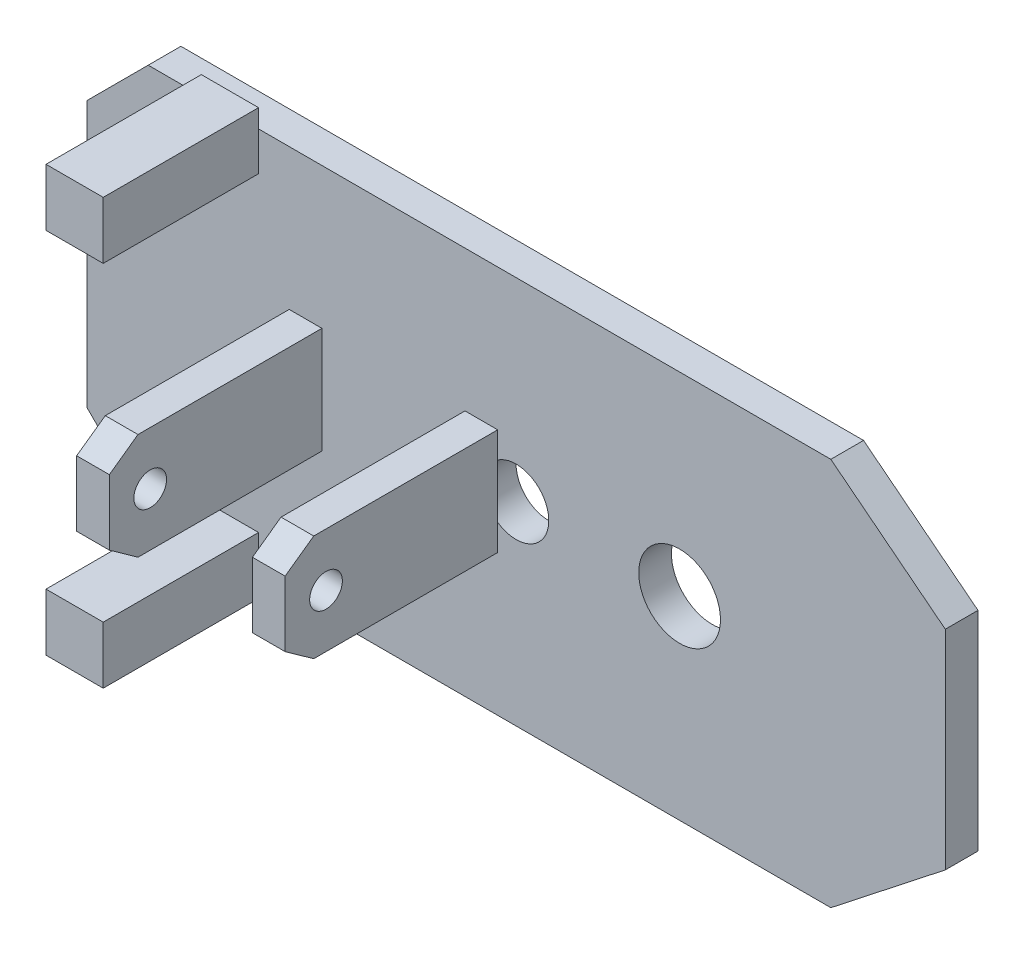
ISO-10303-21;
HEADER;
FILE_DESCRIPTION(('STEP AP214'),'2;1');
FILE_NAME('part.step','',(''),(''),'','','');
FILE_SCHEMA(('AUTOMOTIVE_DESIGN { 1 0 10303 214 1 1 1 1 }'));
ENDSEC;
DATA;
#1=APPLICATION_CONTEXT('core data for automotive mechanical design processes');
#2=APPLICATION_PROTOCOL_DEFINITION('international standard','automotive_design',2000,#1);
#3=PRODUCT_CONTEXT('',#1,'mechanical');
#4=PRODUCT('Part','Part','',(#3));
#5=PRODUCT_RELATED_PRODUCT_CATEGORY('part','',(#4));
#6=PRODUCT_DEFINITION_FORMATION('','',#4);
#7=PRODUCT_DEFINITION_CONTEXT('part definition',#1,'design');
#8=PRODUCT_DEFINITION('design','',#6,#7);
#9=PRODUCT_DEFINITION_SHAPE('','',#8);
#10=(LENGTH_UNIT() NAMED_UNIT(*) SI_UNIT(.MILLI.,.METRE.));
#11=(NAMED_UNIT(*) PLANE_ANGLE_UNIT() SI_UNIT($,.RADIAN.));
#12=(NAMED_UNIT(*) SI_UNIT($,.STERADIAN.) SOLID_ANGLE_UNIT());
#13=UNCERTAINTY_MEASURE_WITH_UNIT(LENGTH_MEASURE(1.E-05),#10,'distance_accuracy_value','');
#14=(GEOMETRIC_REPRESENTATION_CONTEXT(3) GLOBAL_UNCERTAINTY_ASSIGNED_CONTEXT((#13)) GLOBAL_UNIT_ASSIGNED_CONTEXT((#10,
#11,#12)) REPRESENTATION_CONTEXT('',''));
#15=CARTESIAN_POINT('',(0.,0.,0.));
#16=DIRECTION('',(0.,0.,1.));
#17=DIRECTION('',(1.,0.,0.));
#18=AXIS2_PLACEMENT_3D('',#15,#16,#17);
#19=CARTESIAN_POINT('',(0.,0.,-42.));
#20=DIRECTION('',(0.,0.,1.));
#21=DIRECTION('',(1.,0.,0.));
#22=AXIS2_PLACEMENT_3D('',#19,#20,#21);
#23=PLANE('',#22);
#24=DIRECTION('',(0.,-1.,0.));
#25=VECTOR('',#24,1.);
#26=CARTESIAN_POINT('',(-47.,38.,-42.));
#27=LINE('',#26,#25);
#28=CARTESIAN_POINT('',(-47.,47.5,-42.));
#29=VERTEX_POINT('',#28);
#30=CARTESIAN_POINT('',(-47.,38.,-42.));
#31=VERTEX_POINT('',#30);
#32=EDGE_CURVE('E11',#29,#31,#27,.T.);
#33=ORIENTED_EDGE('',*,*,#32,.F.);
#34=DIRECTION('',(-1.,0.,0.));
#35=VECTOR('',#34,1.);
#36=CARTESIAN_POINT('',(-60.,47.5,-42.));
#37=LINE('',#36,#35);
#38=CARTESIAN_POINT('',(-60.,47.5,-42.));
#39=VERTEX_POINT('',#38);
#40=EDGE_CURVE('E438',#29,#39,#37,.T.);
#41=ORIENTED_EDGE('',*,*,#40,.T.);
#42=DIRECTION('',(-0.707106781186547,-0.707106781186547,0.));
#43=VECTOR('',#42,1.);
#44=CARTESIAN_POINT('',(-75.,32.5,-42.));
#45=LINE('',#44,#43);
#46=CARTESIAN_POINT('',(-75.,32.5,-42.));
#47=VERTEX_POINT('',#46);
#48=EDGE_CURVE('E419',#39,#47,#45,.T.);
#49=ORIENTED_EDGE('',*,*,#48,.T.);
#50=DIRECTION('',(0.,-1.,0.));
#51=VECTOR('',#50,1.);
#52=CARTESIAN_POINT('',(-75.,-32.5,-42.));
#53=LINE('',#52,#51);
#54=CARTESIAN_POINT('',(-75.,-32.5,-42.));
#55=VERTEX_POINT('',#54);
#56=EDGE_CURVE('E421',#47,#55,#53,.T.);
#57=ORIENTED_EDGE('',*,*,#56,.T.);
#58=DIRECTION('',(0.707106781186547,-0.707106781186547,0.));
#59=VECTOR('',#58,1.);
#60=CARTESIAN_POINT('',(-60.,-47.5,-42.));
#61=LINE('',#60,#59);
#62=CARTESIAN_POINT('',(-60.,-47.5,-42.));
#63=VERTEX_POINT('',#62);
#64=EDGE_CURVE('E426',#55,#63,#61,.T.);
#65=ORIENTED_EDGE('',*,*,#64,.T.);
#66=DIRECTION('',(1.,0.,0.));
#67=VECTOR('',#66,1.);
#68=CARTESIAN_POINT('',(107.,-47.5,-42.));
#69=LINE('',#68,#67);
#70=CARTESIAN_POINT('',(-47.,-47.5,-42.));
#71=VERTEX_POINT('',#70);
#72=EDGE_CURVE('E427',#63,#71,#69,.T.);
#73=ORIENTED_EDGE('',*,*,#72,.T.);
#74=DIRECTION('',(0.,-1.,0.));
#75=VECTOR('',#74,1.);
#76=CARTESIAN_POINT('',(-47.,-52.,-42.));
#77=LINE('',#76,#75);
#78=CARTESIAN_POINT('',(-47.,-38.,-42.));
#79=VERTEX_POINT('',#78);
#80=EDGE_CURVE('E268',#79,#71,#77,.T.);
#81=ORIENTED_EDGE('',*,*,#80,.F.);
#82=DIRECTION('',(-1.,0.,0.));
#83=VECTOR('',#82,1.);
#84=CARTESIAN_POINT('',(-47.,-38.,-42.));
#85=LINE('',#84,#83);
#86=CARTESIAN_POINT('',(-33.,-38.,-42.));
#87=VERTEX_POINT('',#86);
#88=EDGE_CURVE('E279',#87,#79,#85,.T.);
#89=ORIENTED_EDGE('',*,*,#88,.F.);
#90=DIRECTION('',(0.,1.,0.));
#91=VECTOR('',#90,1.);
#92=CARTESIAN_POINT('',(-33.,-38.,-42.));
#93=LINE('',#92,#91);
#94=CARTESIAN_POINT('',(-33.,-47.5,-42.));
#95=VERTEX_POINT('',#94);
#96=EDGE_CURVE('E48',#95,#87,#93,.T.);
#97=ORIENTED_EDGE('',*,*,#96,.F.);
#98=CARTESIAN_POINT('',(107.,-47.5,-42.));
#99=VERTEX_POINT('',#98);
#100=EDGE_CURVE('E428',#95,#99,#69,.T.);
#101=ORIENTED_EDGE('',*,*,#100,.T.);
#102=DIRECTION('',(0.786318338822423,0.617821551931904,0.));
#103=VECTOR('',#102,1.);
#104=CARTESIAN_POINT('',(135.,-25.5,-42.));
#105=LINE('',#104,#103);
#106=CARTESIAN_POINT('',(135.,-25.5,-42.));
#107=VERTEX_POINT('',#106);
#108=EDGE_CURVE('E435',#99,#107,#105,.T.);
#109=ORIENTED_EDGE('',*,*,#108,.T.);
#110=DIRECTION('',(0.,1.,0.));
#111=VECTOR('',#110,1.);
#112=CARTESIAN_POINT('',(135.,25.5,-42.));
#113=LINE('',#112,#111);
#114=CARTESIAN_POINT('',(135.,25.5,-42.));
#115=VERTEX_POINT('',#114);
#116=EDGE_CURVE('E434',#107,#115,#113,.T.);
#117=ORIENTED_EDGE('',*,*,#116,.T.);
#118=DIRECTION('',(-0.786318338822423,0.617821551931904,0.));
#119=VECTOR('',#118,1.);
#120=CARTESIAN_POINT('',(107.,47.5,-42.));
#121=LINE('',#120,#119);
#122=CARTESIAN_POINT('',(107.,47.5,-42.));
#123=VERTEX_POINT('',#122);
#124=EDGE_CURVE('E440',#115,#123,#121,.T.);
#125=ORIENTED_EDGE('',*,*,#124,.T.);
#126=CARTESIAN_POINT('',(-33.,47.5,-42.));
#127=VERTEX_POINT('',#126);
#128=EDGE_CURVE('E439',#123,#127,#37,.T.);
#129=ORIENTED_EDGE('',*,*,#128,.T.);
#130=DIRECTION('',(0.,1.,0.));
#131=VECTOR('',#130,1.);
#132=CARTESIAN_POINT('',(-33.,52.,-42.));
#133=LINE('',#132,#131);
#134=CARTESIAN_POINT('',(-33.,38.,-42.));
#135=VERTEX_POINT('',#134);
#136=EDGE_CURVE('E832',#135,#127,#133,.T.);
#137=ORIENTED_EDGE('',*,*,#136,.F.);
#138=DIRECTION('',(1.,0.,0.));
#139=VECTOR('',#138,1.);
#140=CARTESIAN_POINT('',(-33.,38.,-42.));
#141=LINE('',#140,#139);
#142=EDGE_CURVE('E833',#31,#135,#141,.T.);
#143=ORIENTED_EDGE('',*,*,#142,.F.);
#144=EDGE_LOOP('',(#33,#41,#49,#57,#65,#73,#81,#89,#97,#101,#109,#117,#125,#129,#137,#143));
#145=FACE_BOUND('',#144,.T.);
#146=DIRECTION('',(-1.,0.,0.));
#147=VECTOR('',#146,1.);
#148=CARTESIAN_POINT('',(-17.5,13.,-42.));
#149=LINE('',#148,#147);
#150=CARTESIAN_POINT('',(-17.5,13.,-42.));
#151=VERTEX_POINT('',#150);
#152=CARTESIAN_POINT('',(-25.5,13.,-42.));
#153=VERTEX_POINT('',#152);
#154=EDGE_CURVE('E325',#151,#153,#149,.T.);
#155=ORIENTED_EDGE('',*,*,#154,.F.);
#156=DIRECTION('',(0.,1.,0.));
#157=VECTOR('',#156,1.);
#158=CARTESIAN_POINT('',(-17.5,13.,-42.));
#159=LINE('',#158,#157);
#160=CARTESIAN_POINT('',(-17.5,-13.,-42.));
#161=VERTEX_POINT('',#160);
#162=EDGE_CURVE('E319',#161,#151,#159,.T.);
#163=ORIENTED_EDGE('',*,*,#162,.F.);
#164=DIRECTION('',(-1.,0.,0.));
#165=VECTOR('',#164,1.);
#166=CARTESIAN_POINT('',(-17.5,-13.,-42.));
#167=LINE('',#166,#165);
#168=CARTESIAN_POINT('',(-25.5,-13.,-42.));
#169=VERTEX_POINT('',#168);
#170=EDGE_CURVE('E340',#161,#169,#167,.T.);
#171=ORIENTED_EDGE('',*,*,#170,.T.);
#172=DIRECTION('',(0.,1.,0.));
#173=VECTOR('',#172,1.);
#174=CARTESIAN_POINT('',(-25.5,13.,-42.));
#175=LINE('',#174,#173);
#176=EDGE_CURVE('E315',#169,#153,#175,.T.);
#177=ORIENTED_EDGE('',*,*,#176,.T.);
#178=EDGE_LOOP('',(#155,#163,#171,#177));
#179=FACE_BOUND('',#178,.T.);
#180=DIRECTION('',(0.,1.,0.));
#181=VECTOR('',#180,1.);
#182=CARTESIAN_POINT('',(25.5,13.,-42.));
#183=LINE('',#182,#181);
#184=CARTESIAN_POINT('',(25.5,6.61437827766148,-42.));
#185=VERTEX_POINT('',#184);
#186=CARTESIAN_POINT('',(25.5,13.,-42.));
#187=VERTEX_POINT('',#186);
#188=EDGE_CURVE('E376',#185,#187,#183,.T.);
#189=ORIENTED_EDGE('',*,*,#188,.F.);
#190=CARTESIAN_POINT('',(30.,0.,-42.));
#191=DIRECTION('',(0.,0.,1.));
#192=DIRECTION('',(1.,0.,0.));
#193=AXIS2_PLACEMENT_3D('',#190,#191,#192);
#194=CIRCLE('',#193,8.);
#195=CARTESIAN_POINT('',(25.5,-6.61437827766147,-42.));
#196=VERTEX_POINT('',#195);
#197=EDGE_CURVE('E412',#196,#185,#194,.T.);
#198=ORIENTED_EDGE('',*,*,#197,.F.);
#199=CARTESIAN_POINT('',(25.5,-13.,-42.));
#200=VERTEX_POINT('',#199);
#201=EDGE_CURVE('E375',#200,#196,#183,.T.);
#202=ORIENTED_EDGE('',*,*,#201,.F.);
#203=DIRECTION('',(-1.,0.,0.));
#204=VECTOR('',#203,1.);
#205=CARTESIAN_POINT('',(25.5,-13.,-42.));
#206=LINE('',#205,#204);
#207=CARTESIAN_POINT('',(17.5,-13.,-42.));
#208=VERTEX_POINT('',#207);
#209=EDGE_CURVE('E391',#200,#208,#206,.T.);
#210=ORIENTED_EDGE('',*,*,#209,.T.);
#211=DIRECTION('',(0.,1.,0.));
#212=VECTOR('',#211,1.);
#213=CARTESIAN_POINT('',(17.5,13.,-42.));
#214=LINE('',#213,#212);
#215=CARTESIAN_POINT('',(17.5,13.,-42.));
#216=VERTEX_POINT('',#215);
#217=EDGE_CURVE('E361',#208,#216,#214,.T.);
#218=ORIENTED_EDGE('',*,*,#217,.T.);
#219=DIRECTION('',(-1.,0.,0.));
#220=VECTOR('',#219,1.);
#221=CARTESIAN_POINT('',(25.5,13.,-42.));
#222=LINE('',#221,#220);
#223=EDGE_CURVE('E374',#187,#216,#222,.T.);
#224=ORIENTED_EDGE('',*,*,#223,.F.);
#225=EDGE_LOOP('',(#189,#198,#202,#210,#218,#224));
#226=FACE_BOUND('',#225,.T.);
#227=CARTESIAN_POINT('',(70.,0.,-42.));
#228=DIRECTION('',(0.,0.,1.));
#229=DIRECTION('',(1.,0.,0.));
#230=AXIS2_PLACEMENT_3D('',#227,#228,#229);
#231=CIRCLE('',#230,9.99999999999999);
#232=CARTESIAN_POINT('',(80.,0.,-42.));
#233=VERTEX_POINT('',#232);
#234=EDGE_CURVE('E411',#233,#233,#231,.T.);
#235=ORIENTED_EDGE('',*,*,#234,.F.);
#236=EDGE_LOOP('',(#235));
#237=FACE_BOUND('',#236,.T.);
#238=ADVANCED_FACE('F39',(#145,#179,#226,#237),#23,.T.);
#239=CARTESIAN_POINT('',(0.,0.,-50.));
#240=DIRECTION('',(0.,0.,1.));
#241=DIRECTION('',(1.,0.,0.));
#242=AXIS2_PLACEMENT_3D('',#239,#240,#241);
#243=PLANE('',#242);
#244=DIRECTION('',(-0.707106781186547,-0.707106781186547,0.));
#245=VECTOR('',#244,1.);
#246=CARTESIAN_POINT('',(-75.,32.5,-50.));
#247=LINE('',#246,#245);
#248=CARTESIAN_POINT('',(-60.,47.5,-50.));
#249=VERTEX_POINT('',#248);
#250=CARTESIAN_POINT('',(-75.,32.5,-50.));
#251=VERTEX_POINT('',#250);
#252=EDGE_CURVE('E417',#249,#251,#247,.T.);
#253=ORIENTED_EDGE('',*,*,#252,.F.);
#254=DIRECTION('',(-1.,0.,0.));
#255=VECTOR('',#254,1.);
#256=CARTESIAN_POINT('',(-60.,47.5,-50.));
#257=LINE('',#256,#255);
#258=CARTESIAN_POINT('',(107.,47.5,-50.));
#259=VERTEX_POINT('',#258);
#260=EDGE_CURVE('E424',#259,#249,#257,.T.);
#261=ORIENTED_EDGE('',*,*,#260,.F.);
#262=DIRECTION('',(-0.786318338822423,0.617821551931904,0.));
#263=VECTOR('',#262,1.);
#264=CARTESIAN_POINT('',(107.,47.5,-50.));
#265=LINE('',#264,#263);
#266=CARTESIAN_POINT('',(135.,25.5,-50.));
#267=VERTEX_POINT('',#266);
#268=EDGE_CURVE('E460',#267,#259,#265,.T.);
#269=ORIENTED_EDGE('',*,*,#268,.F.);
#270=DIRECTION('',(0.,1.,0.));
#271=VECTOR('',#270,1.);
#272=CARTESIAN_POINT('',(135.,25.5,-50.));
#273=LINE('',#272,#271);
#274=CARTESIAN_POINT('',(135.,-25.5,-50.));
#275=VERTEX_POINT('',#274);
#276=EDGE_CURVE('E453',#275,#267,#273,.T.);
#277=ORIENTED_EDGE('',*,*,#276,.F.);
#278=DIRECTION('',(0.786318338822423,0.617821551931904,0.));
#279=VECTOR('',#278,1.);
#280=CARTESIAN_POINT('',(135.,-25.5,-50.));
#281=LINE('',#280,#279);
#282=CARTESIAN_POINT('',(107.,-47.5,-50.));
#283=VERTEX_POINT('',#282);
#284=EDGE_CURVE('E454',#283,#275,#281,.T.);
#285=ORIENTED_EDGE('',*,*,#284,.F.);
#286=DIRECTION('',(1.,0.,0.));
#287=VECTOR('',#286,1.);
#288=CARTESIAN_POINT('',(107.,-47.5,-50.));
#289=LINE('',#288,#287);
#290=CARTESIAN_POINT('',(-60.,-47.5,-50.));
#291=VERTEX_POINT('',#290);
#292=EDGE_CURVE('E452',#291,#283,#289,.T.);
#293=ORIENTED_EDGE('',*,*,#292,.F.);
#294=DIRECTION('',(0.707106781186547,-0.707106781186547,0.));
#295=VECTOR('',#294,1.);
#296=CARTESIAN_POINT('',(-60.,-47.5,-50.));
#297=LINE('',#296,#295);
#298=CARTESIAN_POINT('',(-75.,-32.5,-50.));
#299=VERTEX_POINT('',#298);
#300=EDGE_CURVE('E448',#299,#291,#297,.T.);
#301=ORIENTED_EDGE('',*,*,#300,.F.);
#302=DIRECTION('',(0.,-1.,0.));
#303=VECTOR('',#302,1.);
#304=CARTESIAN_POINT('',(-75.,-32.5,-50.));
#305=LINE('',#304,#303);
#306=EDGE_CURVE('E450',#251,#299,#305,.T.);
#307=ORIENTED_EDGE('',*,*,#306,.F.);
#308=EDGE_LOOP('',(#253,#261,#269,#277,#285,#293,#301,#307));
#309=FACE_BOUND('',#308,.T.);
#310=CARTESIAN_POINT('',(70.,0.,-50.));
#311=DIRECTION('',(0.,0.,1.));
#312=DIRECTION('',(1.,0.,0.));
#313=AXIS2_PLACEMENT_3D('',#310,#311,#312);
#314=CIRCLE('',#313,9.99999999999999);
#315=CARTESIAN_POINT('',(80.,0.,-50.));
#316=VERTEX_POINT('',#315);
#317=EDGE_CURVE('E409',#316,#316,#314,.T.);
#318=ORIENTED_EDGE('',*,*,#317,.T.);
#319=EDGE_LOOP('',(#318));
#320=FACE_BOUND('',#319,.T.);
#321=CARTESIAN_POINT('',(30.,0.,-50.));
#322=DIRECTION('',(0.,0.,1.));
#323=DIRECTION('',(1.,0.,0.));
#324=AXIS2_PLACEMENT_3D('',#321,#322,#323);
#325=CIRCLE('',#324,8.);
#326=CARTESIAN_POINT('',(38.,0.,-50.));
#327=VERTEX_POINT('',#326);
#328=EDGE_CURVE('E406',#327,#327,#325,.T.);
#329=ORIENTED_EDGE('',*,*,#328,.T.);
#330=EDGE_LOOP('',(#329));
#331=FACE_BOUND('',#330,.T.);
#332=ADVANCED_FACE('F517',(#309,#320,#331),#243,.F.);
#333=CARTESIAN_POINT('',(-75.,32.5,-42.));
#334=DIRECTION('',(0.707106781186547,-0.707106781186547,0.));
#335=DIRECTION('',(0.707106781186548,0.707106781186548,0.));
#336=AXIS2_PLACEMENT_3D('',#333,#334,#335);
#337=PLANE('',#336);
#338=ORIENTED_EDGE('',*,*,#252,.T.);
#339=DIRECTION('',(0.,0.,-1.));
#340=VECTOR('',#339,1.);
#341=CARTESIAN_POINT('',(-75.,32.5,-42.));
#342=LINE('',#341,#340);
#343=EDGE_CURVE('E43',#47,#251,#342,.T.);
#344=ORIENTED_EDGE('',*,*,#343,.F.);
#345=ORIENTED_EDGE('',*,*,#48,.F.);
#346=DIRECTION('',(0.,0.,-1.));
#347=VECTOR('',#346,1.);
#348=CARTESIAN_POINT('',(-60.,47.5,-42.));
#349=LINE('',#348,#347);
#350=EDGE_CURVE('E444',#39,#249,#349,.T.);
#351=ORIENTED_EDGE('',*,*,#350,.T.);
#352=EDGE_LOOP('',(#338,#344,#345,#351));
#353=FACE_BOUND('',#352,.T.);
#354=ADVANCED_FACE('F41',(#353),#337,.F.);
#355=CARTESIAN_POINT('',(-75.,-32.5,-42.));
#356=DIRECTION('',(1.,0.,0.));
#357=DIRECTION('',(0.,0.,-1.));
#358=AXIS2_PLACEMENT_3D('',#355,#356,#357);
#359=PLANE('',#358);
#360=ORIENTED_EDGE('',*,*,#306,.T.);
#361=DIRECTION('',(0.,0.,-1.));
#362=VECTOR('',#361,1.);
#363=CARTESIAN_POINT('',(-75.,-32.5,-42.));
#364=LINE('',#363,#362);
#365=EDGE_CURVE('E478',#55,#299,#364,.T.);
#366=ORIENTED_EDGE('',*,*,#365,.F.);
#367=ORIENTED_EDGE('',*,*,#56,.F.);
#368=ORIENTED_EDGE('',*,*,#343,.T.);
#369=EDGE_LOOP('',(#360,#366,#367,#368));
#370=FACE_BOUND('',#369,.T.);
#371=ADVANCED_FACE('F551',(#370),#359,.F.);
#372=CARTESIAN_POINT('',(-60.,-47.5,-42.));
#373=DIRECTION('',(0.707106781186547,0.707106781186547,0.));
#374=DIRECTION('',(-0.707106781186548,0.707106781186548,0.));
#375=AXIS2_PLACEMENT_3D('',#372,#373,#374);
#376=PLANE('',#375);
#377=ORIENTED_EDGE('',*,*,#300,.T.);
#378=DIRECTION('',(0.,0.,-1.));
#379=VECTOR('',#378,1.);
#380=CARTESIAN_POINT('',(-60.,-47.5,-42.));
#381=LINE('',#380,#379);
#382=EDGE_CURVE('E475',#63,#291,#381,.T.);
#383=ORIENTED_EDGE('',*,*,#382,.F.);
#384=ORIENTED_EDGE('',*,*,#64,.F.);
#385=ORIENTED_EDGE('',*,*,#365,.T.);
#386=EDGE_LOOP('',(#377,#383,#384,#385));
#387=FACE_BOUND('',#386,.T.);
#388=ADVANCED_FACE('F552',(#387),#376,.F.);
#389=CARTESIAN_POINT('',(107.,-47.5,-42.));
#390=DIRECTION('',(0.,1.,0.));
#391=DIRECTION('',(0.,0.,1.));
#392=AXIS2_PLACEMENT_3D('',#389,#390,#391);
#393=PLANE('',#392);
#394=ORIENTED_EDGE('',*,*,#292,.T.);
#395=DIRECTION('',(0.,0.,-1.));
#396=VECTOR('',#395,1.);
#397=CARTESIAN_POINT('',(107.,-47.5,-42.));
#398=LINE('',#397,#396);
#399=EDGE_CURVE('E473',#99,#283,#398,.T.);
#400=ORIENTED_EDGE('',*,*,#399,.F.);
#401=ORIENTED_EDGE('',*,*,#100,.F.);
#402=EDGE_CURVE('E433',#71,#95,#69,.T.);
#403=ORIENTED_EDGE('',*,*,#402,.F.);
#404=ORIENTED_EDGE('',*,*,#72,.F.);
#405=ORIENTED_EDGE('',*,*,#382,.T.);
#406=EDGE_LOOP('',(#394,#400,#401,#403,#404,#405));
#407=FACE_BOUND('',#406,.T.);
#408=ADVANCED_FACE('F550',(#407),#393,.F.);
#409=CARTESIAN_POINT('',(135.,-25.5,-42.));
#410=DIRECTION('',(-0.617821551931904,0.786318338822423,0.));
#411=DIRECTION('',(-0.786318338822423,-0.617821551931904,0.));
#412=AXIS2_PLACEMENT_3D('',#409,#410,#411);
#413=PLANE('',#412);
#414=ORIENTED_EDGE('',*,*,#284,.T.);
#415=DIRECTION('',(0.,0.,-1.));
#416=VECTOR('',#415,1.);
#417=CARTESIAN_POINT('',(135.,-25.5,-42.));
#418=LINE('',#417,#416);
#419=EDGE_CURVE('E469',#107,#275,#418,.T.);
#420=ORIENTED_EDGE('',*,*,#419,.F.);
#421=ORIENTED_EDGE('',*,*,#108,.F.);
#422=ORIENTED_EDGE('',*,*,#399,.T.);
#423=EDGE_LOOP('',(#414,#420,#421,#422));
#424=FACE_BOUND('',#423,.T.);
#425=ADVANCED_FACE('F543',(#424),#413,.F.);
#426=CARTESIAN_POINT('',(135.,25.5,-42.));
#427=DIRECTION('',(-1.,0.,0.));
#428=DIRECTION('',(0.,0.,1.));
#429=AXIS2_PLACEMENT_3D('',#426,#427,#428);
#430=PLANE('',#429);
#431=ORIENTED_EDGE('',*,*,#276,.T.);
#432=DIRECTION('',(0.,0.,-1.));
#433=VECTOR('',#432,1.);
#434=CARTESIAN_POINT('',(135.,25.5,-42.));
#435=LINE('',#434,#433);
#436=EDGE_CURVE('E464',#115,#267,#435,.T.);
#437=ORIENTED_EDGE('',*,*,#436,.F.);
#438=ORIENTED_EDGE('',*,*,#116,.F.);
#439=ORIENTED_EDGE('',*,*,#419,.T.);
#440=EDGE_LOOP('',(#431,#437,#438,#439));
#441=FACE_BOUND('',#440,.T.);
#442=ADVANCED_FACE('F537',(#441),#430,.F.);
#443=CARTESIAN_POINT('',(107.,47.5,-42.));
#444=DIRECTION('',(-0.617821551931904,-0.786318338822423,0.));
#445=DIRECTION('',(0.786318338822423,-0.617821551931904,0.));
#446=AXIS2_PLACEMENT_3D('',#443,#444,#445);
#447=PLANE('',#446);
#448=ORIENTED_EDGE('',*,*,#268,.T.);
#449=DIRECTION('',(0.,0.,-1.));
#450=VECTOR('',#449,1.);
#451=CARTESIAN_POINT('',(107.,47.5,-42.));
#452=LINE('',#451,#450);
#453=EDGE_CURVE('E465',#123,#259,#452,.T.);
#454=ORIENTED_EDGE('',*,*,#453,.F.);
#455=ORIENTED_EDGE('',*,*,#124,.F.);
#456=ORIENTED_EDGE('',*,*,#436,.T.);
#457=EDGE_LOOP('',(#448,#454,#455,#456));
#458=FACE_BOUND('',#457,.T.);
#459=ADVANCED_FACE('F532',(#458),#447,.F.);
#460=CARTESIAN_POINT('',(-60.,47.5,-42.));
#461=DIRECTION('',(0.,-1.,0.));
#462=DIRECTION('',(0.,0.,-1.));
#463=AXIS2_PLACEMENT_3D('',#460,#461,#462);
#464=PLANE('',#463);
#465=ORIENTED_EDGE('',*,*,#260,.T.);
#466=ORIENTED_EDGE('',*,*,#350,.F.);
#467=ORIENTED_EDGE('',*,*,#40,.F.);
#468=EDGE_CURVE('E441',#127,#29,#37,.T.);
#469=ORIENTED_EDGE('',*,*,#468,.F.);
#470=ORIENTED_EDGE('',*,*,#128,.F.);
#471=ORIENTED_EDGE('',*,*,#453,.T.);
#472=EDGE_LOOP('',(#465,#466,#467,#469,#470,#471));
#473=FACE_BOUND('',#472,.T.);
#474=ADVANCED_FACE('F531',(#473),#464,.F.);
#475=CARTESIAN_POINT('',(70.,0.,-42.));
#476=DIRECTION('',(0.,0.,-1.));
#477=DIRECTION('',(-1.,0.,0.));
#478=AXIS2_PLACEMENT_3D('',#475,#476,#477);
#479=CYLINDRICAL_SURFACE('',#478,9.99999999999999);
#480=ORIENTED_EDGE('',*,*,#234,.T.);
#481=EDGE_LOOP('',(#480));
#482=FACE_BOUND('',#481,.T.);
#483=ORIENTED_EDGE('',*,*,#317,.F.);
#484=EDGE_LOOP('',(#483));
#485=FACE_BOUND('',#484,.T.);
#486=ADVANCED_FACE('F529',(#482,#485),#479,.F.);
#487=CARTESIAN_POINT('',(30.,0.,-42.));
#488=DIRECTION('',(0.,0.,-1.));
#489=DIRECTION('',(-1.,0.,0.));
#490=AXIS2_PLACEMENT_3D('',#487,#488,#489);
#491=CYLINDRICAL_SURFACE('',#490,8.);
#492=EDGE_CURVE('E410',#185,#196,#194,.T.);
#493=ORIENTED_EDGE('',*,*,#492,.T.);
#494=ORIENTED_EDGE('',*,*,#197,.T.);
#495=EDGE_LOOP('',(#493,#494));
#496=FACE_BOUND('',#495,.T.);
#497=ORIENTED_EDGE('',*,*,#328,.F.);
#498=EDGE_LOOP('',(#497));
#499=FACE_BOUND('',#498,.T.);
#500=ADVANCED_FACE('F496',(#496,#499),#491,.F.);
#501=CARTESIAN_POINT('',(25.5,0.,0.));
#502=DIRECTION('',(-1.,0.,0.));
#503=DIRECTION('',(0.,0.,1.));
#504=AXIS2_PLACEMENT_3D('',#501,#502,#503);
#505=PLANE('',#504);
#506=DIRECTION('',(0.,0.,1.));
#507=VECTOR('',#506,1.);
#508=CARTESIAN_POINT('',(25.5,13.,3.));
#509=LINE('',#508,#507);
#510=CARTESIAN_POINT('',(25.5,13.,3.));
#511=VERTEX_POINT('',#510);
#512=EDGE_CURVE('E356',#187,#511,#509,.T.);
#513=ORIENTED_EDGE('',*,*,#512,.T.);
#514=DIRECTION('',(0.,-0.581238193719096,0.813733471206735));
#515=VECTOR('',#514,1.);
#516=CARTESIAN_POINT('',(25.5,8.,10.));
#517=LINE('',#516,#515);
#518=CARTESIAN_POINT('',(25.5,8.,10.));
#519=VERTEX_POINT('',#518);
#520=EDGE_CURVE('E362',#511,#519,#517,.T.);
#521=ORIENTED_EDGE('',*,*,#520,.T.);
#522=DIRECTION('',(0.,-1.,0.));
#523=VECTOR('',#522,1.);
#524=CARTESIAN_POINT('',(25.5,-8.,10.));
#525=LINE('',#524,#523);
#526=CARTESIAN_POINT('',(25.5,-8.,10.));
#527=VERTEX_POINT('',#526);
#528=EDGE_CURVE('E364',#519,#527,#525,.T.);
#529=ORIENTED_EDGE('',*,*,#528,.T.);
#530=DIRECTION('',(0.,-0.581238193719096,-0.813733471206735));
#531=VECTOR('',#530,1.);
#532=CARTESIAN_POINT('',(25.5,-13.,3.));
#533=LINE('',#532,#531);
#534=CARTESIAN_POINT('',(25.5,-13.,3.));
#535=VERTEX_POINT('',#534);
#536=EDGE_CURVE('E370',#527,#535,#533,.T.);
#537=ORIENTED_EDGE('',*,*,#536,.T.);
#538=DIRECTION('',(0.,0.,-1.));
#539=VECTOR('',#538,1.);
#540=CARTESIAN_POINT('',(25.5,-13.,-42.));
#541=LINE('',#540,#539);
#542=EDGE_CURVE('E369',#535,#200,#541,.T.);
#543=ORIENTED_EDGE('',*,*,#542,.T.);
#544=ORIENTED_EDGE('',*,*,#201,.T.);
#545=EDGE_CURVE('E371',#196,#185,#183,.T.);
#546=ORIENTED_EDGE('',*,*,#545,.T.);
#547=ORIENTED_EDGE('',*,*,#188,.T.);
#548=EDGE_LOOP('',(#513,#521,#529,#537,#543,#544,#546,#547));
#549=FACE_BOUND('',#548,.T.);
#550=CARTESIAN_POINT('',(25.5,0.,0.));
#551=DIRECTION('',(1.,0.,0.));
#552=DIRECTION('',(0.,0.,-1.));
#553=AXIS2_PLACEMENT_3D('',#550,#551,#552);
#554=CIRCLE('',#553,4.);
#555=CARTESIAN_POINT('',(25.5,0.,-4.));
#556=VERTEX_POINT('',#555);
#557=EDGE_CURVE('E352',#556,#556,#554,.T.);
#558=ORIENTED_EDGE('',*,*,#557,.F.);
#559=EDGE_LOOP('',(#558));
#560=FACE_BOUND('',#559,.T.);
#561=ADVANCED_FACE('F487',(#549,#560),#505,.F.);
#562=CARTESIAN_POINT('',(17.5,0.,0.));
#563=DIRECTION('',(-1.,0.,0.));
#564=DIRECTION('',(0.,0.,1.));
#565=AXIS2_PLACEMENT_3D('',#562,#563,#564);
#566=PLANE('',#565);
#567=DIRECTION('',(0.,0.,1.));
#568=VECTOR('',#567,1.);
#569=CARTESIAN_POINT('',(17.5,13.,3.));
#570=LINE('',#569,#568);
#571=CARTESIAN_POINT('',(17.5,13.,3.));
#572=VERTEX_POINT('',#571);
#573=EDGE_CURVE('E357',#216,#572,#570,.T.);
#574=ORIENTED_EDGE('',*,*,#573,.F.);
#575=ORIENTED_EDGE('',*,*,#217,.F.);
#576=DIRECTION('',(0.,0.,-1.));
#577=VECTOR('',#576,1.);
#578=CARTESIAN_POINT('',(17.5,-13.,-42.));
#579=LINE('',#578,#577);
#580=CARTESIAN_POINT('',(17.5,-13.,3.));
#581=VERTEX_POINT('',#580);
#582=EDGE_CURVE('E384',#581,#208,#579,.T.);
#583=ORIENTED_EDGE('',*,*,#582,.F.);
#584=DIRECTION('',(0.,-0.581238193719096,-0.813733471206735));
#585=VECTOR('',#584,1.);
#586=CARTESIAN_POINT('',(17.5,-13.,3.));
#587=LINE('',#586,#585);
#588=CARTESIAN_POINT('',(17.5,-8.,10.));
#589=VERTEX_POINT('',#588);
#590=EDGE_CURVE('E382',#589,#581,#587,.T.);
#591=ORIENTED_EDGE('',*,*,#590,.F.);
#592=DIRECTION('',(0.,-1.,0.));
#593=VECTOR('',#592,1.);
#594=CARTESIAN_POINT('',(17.5,-8.,10.));
#595=LINE('',#594,#593);
#596=CARTESIAN_POINT('',(17.5,8.,10.));
#597=VERTEX_POINT('',#596);
#598=EDGE_CURVE('E381',#597,#589,#595,.T.);
#599=ORIENTED_EDGE('',*,*,#598,.F.);
#600=DIRECTION('',(0.,-0.581238193719096,0.813733471206735));
#601=VECTOR('',#600,1.);
#602=CARTESIAN_POINT('',(17.5,8.,10.));
#603=LINE('',#602,#601);
#604=EDGE_CURVE('E377',#572,#597,#603,.T.);
#605=ORIENTED_EDGE('',*,*,#604,.F.);
#606=EDGE_LOOP('',(#574,#575,#583,#591,#599,#605));
#607=FACE_BOUND('',#606,.T.);
#608=CARTESIAN_POINT('',(17.5,0.,0.));
#609=DIRECTION('',(1.,0.,0.));
#610=DIRECTION('',(0.,0.,-1.));
#611=AXIS2_PLACEMENT_3D('',#608,#609,#610);
#612=CIRCLE('',#611,4.);
#613=CARTESIAN_POINT('',(17.5,0.,-4.));
#614=VERTEX_POINT('',#613);
#615=EDGE_CURVE('E355',#614,#614,#612,.T.);
#616=ORIENTED_EDGE('',*,*,#615,.T.);
#617=EDGE_LOOP('',(#616));
#618=FACE_BOUND('',#617,.T.);
#619=ADVANCED_FACE('F646',(#607,#618),#566,.T.);
#620=CARTESIAN_POINT('',(25.5,13.,3.));
#621=DIRECTION('',(0.,-1.,0.));
#622=DIRECTION('',(0.,0.,-1.));
#623=AXIS2_PLACEMENT_3D('',#620,#621,#622);
#624=PLANE('',#623);
#625=ORIENTED_EDGE('',*,*,#573,.T.);
#626=DIRECTION('',(-1.,0.,0.));
#627=VECTOR('',#626,1.);
#628=CARTESIAN_POINT('',(25.5,13.,3.));
#629=LINE('',#628,#627);
#630=EDGE_CURVE('E401',#511,#572,#629,.T.);
#631=ORIENTED_EDGE('',*,*,#630,.F.);
#632=ORIENTED_EDGE('',*,*,#512,.F.);
#633=ORIENTED_EDGE('',*,*,#223,.T.);
#634=EDGE_LOOP('',(#625,#631,#632,#633));
#635=FACE_BOUND('',#634,.T.);
#636=ADVANCED_FACE('F648',(#635),#624,.F.);
#637=CARTESIAN_POINT('',(25.5,8.,10.));
#638=DIRECTION('',(0.,-0.813733471206735,-0.581238193719096));
#639=DIRECTION('',(0.,0.581238193719096,-0.813733471206735));
#640=AXIS2_PLACEMENT_3D('',#637,#638,#639);
#641=PLANE('',#640);
#642=ORIENTED_EDGE('',*,*,#604,.T.);
#643=DIRECTION('',(-1.,0.,0.));
#644=VECTOR('',#643,1.);
#645=CARTESIAN_POINT('',(25.5,8.,10.));
#646=LINE('',#645,#644);
#647=EDGE_CURVE('E398',#519,#597,#646,.T.);
#648=ORIENTED_EDGE('',*,*,#647,.F.);
#649=ORIENTED_EDGE('',*,*,#520,.F.);
#650=ORIENTED_EDGE('',*,*,#630,.T.);
#651=EDGE_LOOP('',(#642,#648,#649,#650));
#652=FACE_BOUND('',#651,.T.);
#653=ADVANCED_FACE('F653',(#652),#641,.F.);
#654=CARTESIAN_POINT('',(25.5,-8.,10.));
#655=DIRECTION('',(0.,0.,-1.));
#656=DIRECTION('',(-1.,0.,0.));
#657=AXIS2_PLACEMENT_3D('',#654,#655,#656);
#658=PLANE('',#657);
#659=ORIENTED_EDGE('',*,*,#598,.T.);
#660=DIRECTION('',(-1.,0.,0.));
#661=VECTOR('',#660,1.);
#662=CARTESIAN_POINT('',(25.5,-8.,10.));
#663=LINE('',#662,#661);
#664=EDGE_CURVE('E400',#527,#589,#663,.T.);
#665=ORIENTED_EDGE('',*,*,#664,.F.);
#666=ORIENTED_EDGE('',*,*,#528,.F.);
#667=ORIENTED_EDGE('',*,*,#647,.T.);
#668=EDGE_LOOP('',(#659,#665,#666,#667));
#669=FACE_BOUND('',#668,.T.);
#670=ADVANCED_FACE('F675',(#669),#658,.F.);
#671=CARTESIAN_POINT('',(25.5,-13.,3.));
#672=DIRECTION('',(0.,0.813733471206735,-0.581238193719096));
#673=DIRECTION('',(0.,0.581238193719096,0.813733471206735));
#674=AXIS2_PLACEMENT_3D('',#671,#672,#673);
#675=PLANE('',#674);
#676=ORIENTED_EDGE('',*,*,#590,.T.);
#677=DIRECTION('',(-1.,0.,0.));
#678=VECTOR('',#677,1.);
#679=CARTESIAN_POINT('',(25.5,-13.,3.));
#680=LINE('',#679,#678);
#681=EDGE_CURVE('E393',#535,#581,#680,.T.);
#682=ORIENTED_EDGE('',*,*,#681,.F.);
#683=ORIENTED_EDGE('',*,*,#536,.F.);
#684=ORIENTED_EDGE('',*,*,#664,.T.);
#685=EDGE_LOOP('',(#676,#682,#683,#684));
#686=FACE_BOUND('',#685,.T.);
#687=ADVANCED_FACE('F511',(#686),#675,.F.);
#688=CARTESIAN_POINT('',(25.5,-13.,-42.));
#689=DIRECTION('',(0.,1.,0.));
#690=DIRECTION('',(0.,0.,1.));
#691=AXIS2_PLACEMENT_3D('',#688,#689,#690);
#692=PLANE('',#691);
#693=ORIENTED_EDGE('',*,*,#582,.T.);
#694=ORIENTED_EDGE('',*,*,#209,.F.);
#695=ORIENTED_EDGE('',*,*,#542,.F.);
#696=ORIENTED_EDGE('',*,*,#681,.T.);
#697=EDGE_LOOP('',(#693,#694,#695,#696));
#698=FACE_BOUND('',#697,.T.);
#699=ADVANCED_FACE('F503',(#698),#692,.F.);
#700=CARTESIAN_POINT('',(25.5,13.,-42.));
#701=DIRECTION('',(0.,0.,1.));
#702=DIRECTION('',(1.,0.,0.));
#703=AXIS2_PLACEMENT_3D('',#700,#701,#702);
#704=PLANE('',#703);
#705=ORIENTED_EDGE('',*,*,#492,.F.);
#706=ORIENTED_EDGE('',*,*,#545,.F.);
#707=EDGE_LOOP('',(#705,#706));
#708=FACE_BOUND('',#707,.T.);
#709=ADVANCED_FACE('F501',(#708),#704,.F.);
#710=CARTESIAN_POINT('',(25.5,0.,0.));
#711=DIRECTION('',(-1.,0.,0.));
#712=DIRECTION('',(0.,0.,1.));
#713=AXIS2_PLACEMENT_3D('',#710,#711,#712);
#714=CYLINDRICAL_SURFACE('',#713,4.);
#715=ORIENTED_EDGE('',*,*,#557,.T.);
#716=EDGE_LOOP('',(#715));
#717=FACE_BOUND('',#716,.T.);
#718=ORIENTED_EDGE('',*,*,#615,.F.);
#719=EDGE_LOOP('',(#718));
#720=FACE_BOUND('',#719,.T.);
#721=ADVANCED_FACE('F502',(#717,#720),#714,.F.);
#722=CARTESIAN_POINT('',(-17.5,0.,0.));
#723=DIRECTION('',(-1.,0.,0.));
#724=DIRECTION('',(0.,0.,1.));
#725=AXIS2_PLACEMENT_3D('',#722,#723,#724);
#726=PLANE('',#725);
#727=DIRECTION('',(0.,0.,1.));
#728=VECTOR('',#727,1.);
#729=CARTESIAN_POINT('',(-17.5,13.,3.));
#730=LINE('',#729,#728);
#731=CARTESIAN_POINT('',(-17.5,13.,3.));
#732=VERTEX_POINT('',#731);
#733=EDGE_CURVE('E306',#151,#732,#730,.T.);
#734=ORIENTED_EDGE('',*,*,#733,.T.);
#735=DIRECTION('',(0.,-0.581238193719096,0.813733471206735));
#736=VECTOR('',#735,1.);
#737=CARTESIAN_POINT('',(-17.5,8.,10.));
#738=LINE('',#737,#736);
#739=CARTESIAN_POINT('',(-17.5,8.,10.));
#740=VERTEX_POINT('',#739);
#741=EDGE_CURVE('E313',#732,#740,#738,.T.);
#742=ORIENTED_EDGE('',*,*,#741,.T.);
#743=DIRECTION('',(0.,-1.,0.));
#744=VECTOR('',#743,1.);
#745=CARTESIAN_POINT('',(-17.5,-8.,10.));
#746=LINE('',#745,#744);
#747=CARTESIAN_POINT('',(-17.5,-8.,10.));
#748=VERTEX_POINT('',#747);
#749=EDGE_CURVE('E314',#740,#748,#746,.T.);
#750=ORIENTED_EDGE('',*,*,#749,.T.);
#751=DIRECTION('',(0.,-0.581238193719096,-0.813733471206735));
#752=VECTOR('',#751,1.);
#753=CARTESIAN_POINT('',(-17.5,-13.,3.));
#754=LINE('',#753,#752);
#755=CARTESIAN_POINT('',(-17.5,-13.,3.));
#756=VERTEX_POINT('',#755);
#757=EDGE_CURVE('E316',#748,#756,#754,.T.);
#758=ORIENTED_EDGE('',*,*,#757,.T.);
#759=DIRECTION('',(0.,0.,-1.));
#760=VECTOR('',#759,1.);
#761=CARTESIAN_POINT('',(-17.5,-13.,-42.));
#762=LINE('',#761,#760);
#763=EDGE_CURVE('E318',#756,#161,#762,.T.);
#764=ORIENTED_EDGE('',*,*,#763,.T.);
#765=ORIENTED_EDGE('',*,*,#162,.T.);
#766=EDGE_LOOP('',(#734,#742,#750,#758,#764,#765));
#767=FACE_BOUND('',#766,.T.);
#768=CARTESIAN_POINT('',(-17.5,0.,0.));
#769=DIRECTION('',(1.,0.,0.));
#770=DIRECTION('',(0.,0.,-1.));
#771=AXIS2_PLACEMENT_3D('',#768,#769,#770);
#772=CIRCLE('',#771,4.);
#773=CARTESIAN_POINT('',(-17.5,0.,-4.));
#774=VERTEX_POINT('',#773);
#775=EDGE_CURVE('E305',#774,#774,#772,.T.);
#776=ORIENTED_EDGE('',*,*,#775,.F.);
#777=EDGE_LOOP('',(#776));
#778=FACE_BOUND('',#777,.T.);
#779=ADVANCED_FACE('F508',(#767,#778),#726,.F.);
#780=CARTESIAN_POINT('',(-25.5,0.,0.));
#781=DIRECTION('',(-1.,0.,0.));
#782=DIRECTION('',(0.,0.,1.));
#783=AXIS2_PLACEMENT_3D('',#780,#781,#782);
#784=PLANE('',#783);
#785=DIRECTION('',(0.,0.,1.));
#786=VECTOR('',#785,1.);
#787=CARTESIAN_POINT('',(-25.5,13.,3.));
#788=LINE('',#787,#786);
#789=CARTESIAN_POINT('',(-25.5,13.,3.));
#790=VERTEX_POINT('',#789);
#791=EDGE_CURVE('E303',#153,#790,#788,.T.);
#792=ORIENTED_EDGE('',*,*,#791,.F.);
#793=ORIENTED_EDGE('',*,*,#176,.F.);
#794=DIRECTION('',(0.,0.,-1.));
#795=VECTOR('',#794,1.);
#796=CARTESIAN_POINT('',(-25.5,-13.,-42.));
#797=LINE('',#796,#795);
#798=CARTESIAN_POINT('',(-25.5,-13.,3.));
#799=VERTEX_POINT('',#798);
#800=EDGE_CURVE('E332',#799,#169,#797,.T.);
#801=ORIENTED_EDGE('',*,*,#800,.F.);
#802=DIRECTION('',(0.,-0.581238193719096,-0.813733471206735));
#803=VECTOR('',#802,1.);
#804=CARTESIAN_POINT('',(-25.5,-13.,3.));
#805=LINE('',#804,#803);
#806=CARTESIAN_POINT('',(-25.5,-8.,10.));
#807=VERTEX_POINT('',#806);
#808=EDGE_CURVE('E328',#807,#799,#805,.T.);
#809=ORIENTED_EDGE('',*,*,#808,.F.);
#810=DIRECTION('',(0.,-1.,0.));
#811=VECTOR('',#810,1.);
#812=CARTESIAN_POINT('',(-25.5,-8.,10.));
#813=LINE('',#812,#811);
#814=CARTESIAN_POINT('',(-25.5,8.,10.));
#815=VERTEX_POINT('',#814);
#816=EDGE_CURVE('E330',#815,#807,#813,.T.);
#817=ORIENTED_EDGE('',*,*,#816,.F.);
#818=DIRECTION('',(0.,-0.581238193719096,0.813733471206735));
#819=VECTOR('',#818,1.);
#820=CARTESIAN_POINT('',(-25.5,8.,10.));
#821=LINE('',#820,#819);
#822=EDGE_CURVE('E324',#790,#815,#821,.T.);
#823=ORIENTED_EDGE('',*,*,#822,.F.);
#824=EDGE_LOOP('',(#792,#793,#801,#809,#817,#823));
#825=FACE_BOUND('',#824,.T.);
#826=CARTESIAN_POINT('',(-25.5,0.,0.));
#827=DIRECTION('',(1.,0.,0.));
#828=DIRECTION('',(0.,0.,-1.));
#829=AXIS2_PLACEMENT_3D('',#826,#827,#828);
#830=CIRCLE('',#829,4.);
#831=CARTESIAN_POINT('',(-25.5,0.,-4.));
#832=VERTEX_POINT('',#831);
#833=EDGE_CURVE('E302',#832,#832,#830,.T.);
#834=ORIENTED_EDGE('',*,*,#833,.T.);
#835=EDGE_LOOP('',(#834));
#836=FACE_BOUND('',#835,.T.);
#837=ADVANCED_FACE('F622',(#825,#836),#784,.T.);
#838=CARTESIAN_POINT('',(-17.5,13.,3.));
#839=DIRECTION('',(0.,-1.,0.));
#840=DIRECTION('',(0.,0.,-1.));
#841=AXIS2_PLACEMENT_3D('',#838,#839,#840);
#842=PLANE('',#841);
#843=ORIENTED_EDGE('',*,*,#791,.T.);
#844=DIRECTION('',(-1.,0.,0.));
#845=VECTOR('',#844,1.);
#846=CARTESIAN_POINT('',(-17.5,13.,3.));
#847=LINE('',#846,#845);
#848=EDGE_CURVE('E349',#732,#790,#847,.T.);
#849=ORIENTED_EDGE('',*,*,#848,.F.);
#850=ORIENTED_EDGE('',*,*,#733,.F.);
#851=ORIENTED_EDGE('',*,*,#154,.T.);
#852=EDGE_LOOP('',(#843,#849,#850,#851));
#853=FACE_BOUND('',#852,.T.);
#854=ADVANCED_FACE('F623',(#853),#842,.F.);
#855=CARTESIAN_POINT('',(-17.5,8.,10.));
#856=DIRECTION('',(0.,-0.813733471206735,-0.581238193719096));
#857=DIRECTION('',(0.,0.581238193719096,-0.813733471206735));
#858=AXIS2_PLACEMENT_3D('',#855,#856,#857);
#859=PLANE('',#858);
#860=ORIENTED_EDGE('',*,*,#822,.T.);
#861=DIRECTION('',(-1.,0.,0.));
#862=VECTOR('',#861,1.);
#863=CARTESIAN_POINT('',(-17.5,8.,10.));
#864=LINE('',#863,#862);
#865=EDGE_CURVE('E347',#740,#815,#864,.T.);
#866=ORIENTED_EDGE('',*,*,#865,.F.);
#867=ORIENTED_EDGE('',*,*,#741,.F.);
#868=ORIENTED_EDGE('',*,*,#848,.T.);
#869=EDGE_LOOP('',(#860,#866,#867,#868));
#870=FACE_BOUND('',#869,.T.);
#871=ADVANCED_FACE('F637',(#870),#859,.F.);
#872=CARTESIAN_POINT('',(-17.5,-8.,10.));
#873=DIRECTION('',(0.,0.,-1.));
#874=DIRECTION('',(-1.,0.,0.));
#875=AXIS2_PLACEMENT_3D('',#872,#873,#874);
#876=PLANE('',#875);
#877=ORIENTED_EDGE('',*,*,#816,.T.);
#878=DIRECTION('',(-1.,0.,0.));
#879=VECTOR('',#878,1.);
#880=CARTESIAN_POINT('',(-17.5,-8.,10.));
#881=LINE('',#880,#879);
#882=EDGE_CURVE('E344',#748,#807,#881,.T.);
#883=ORIENTED_EDGE('',*,*,#882,.F.);
#884=ORIENTED_EDGE('',*,*,#749,.F.);
#885=ORIENTED_EDGE('',*,*,#865,.T.);
#886=EDGE_LOOP('',(#877,#883,#884,#885));
#887=FACE_BOUND('',#886,.T.);
#888=ADVANCED_FACE('F634',(#887),#876,.F.);
#889=CARTESIAN_POINT('',(-17.5,-13.,3.));
#890=DIRECTION('',(0.,0.813733471206735,-0.581238193719096));
#891=DIRECTION('',(0.,0.581238193719096,0.813733471206735));
#892=AXIS2_PLACEMENT_3D('',#889,#890,#891);
#893=PLANE('',#892);
#894=ORIENTED_EDGE('',*,*,#808,.T.);
#895=DIRECTION('',(-1.,0.,0.));
#896=VECTOR('',#895,1.);
#897=CARTESIAN_POINT('',(-17.5,-13.,3.));
#898=LINE('',#897,#896);
#899=EDGE_CURVE('E339',#756,#799,#898,.T.);
#900=ORIENTED_EDGE('',*,*,#899,.F.);
#901=ORIENTED_EDGE('',*,*,#757,.F.);
#902=ORIENTED_EDGE('',*,*,#882,.T.);
#903=EDGE_LOOP('',(#894,#900,#901,#902));
#904=FACE_BOUND('',#903,.T.);
#905=ADVANCED_FACE('F628',(#904),#893,.F.);
#906=CARTESIAN_POINT('',(-17.5,-13.,-42.));
#907=DIRECTION('',(0.,1.,0.));
#908=DIRECTION('',(0.,0.,1.));
#909=AXIS2_PLACEMENT_3D('',#906,#907,#908);
#910=PLANE('',#909);
#911=ORIENTED_EDGE('',*,*,#800,.T.);
#912=ORIENTED_EDGE('',*,*,#170,.F.);
#913=ORIENTED_EDGE('',*,*,#763,.F.);
#914=ORIENTED_EDGE('',*,*,#899,.T.);
#915=EDGE_LOOP('',(#911,#912,#913,#914));
#916=FACE_BOUND('',#915,.T.);
#917=ADVANCED_FACE('F620',(#916),#910,.F.);
#918=CARTESIAN_POINT('',(-17.5,0.,0.));
#919=DIRECTION('',(-1.,0.,0.));
#920=DIRECTION('',(0.,0.,1.));
#921=AXIS2_PLACEMENT_3D('',#918,#919,#920);
#922=CYLINDRICAL_SURFACE('',#921,4.);
#923=ORIENTED_EDGE('',*,*,#775,.T.);
#924=EDGE_LOOP('',(#923));
#925=FACE_BOUND('',#924,.T.);
#926=ORIENTED_EDGE('',*,*,#833,.F.);
#927=EDGE_LOOP('',(#926));
#928=FACE_BOUND('',#927,.T.);
#929=ADVANCED_FACE('F611',(#925,#928),#922,.F.);
#930=CARTESIAN_POINT('',(-47.,-52.,-4.));
#931=DIRECTION('',(1.,0.,0.));
#932=DIRECTION('',(0.,0.,-1.));
#933=AXIS2_PLACEMENT_3D('',#930,#931,#932);
#934=PLANE('',#933);
#935=ORIENTED_EDGE('',*,*,#80,.T.);
#936=CARTESIAN_POINT('',(-47.,-52.,-42.));
#937=VERTEX_POINT('',#936);
#938=EDGE_CURVE('E266',#71,#937,#77,.T.);
#939=ORIENTED_EDGE('',*,*,#938,.T.);
#940=DIRECTION('',(0.,0.,-1.));
#941=VECTOR('',#940,1.);
#942=CARTESIAN_POINT('',(-47.,-52.,-4.));
#943=LINE('',#942,#941);
#944=CARTESIAN_POINT('',(-47.,-52.,-4.));
#945=VERTEX_POINT('',#944);
#946=EDGE_CURVE('E297',#945,#937,#943,.T.);
#947=ORIENTED_EDGE('',*,*,#946,.F.);
#948=DIRECTION('',(0.,-1.,0.));
#949=VECTOR('',#948,1.);
#950=CARTESIAN_POINT('',(-47.,-52.,-4.));
#951=LINE('',#950,#949);
#952=CARTESIAN_POINT('',(-47.,-38.,-4.));
#953=VERTEX_POINT('',#952);
#954=EDGE_CURVE('E273',#953,#945,#951,.T.);
#955=ORIENTED_EDGE('',*,*,#954,.F.);
#956=DIRECTION('',(0.,0.,-1.));
#957=VECTOR('',#956,1.);
#958=CARTESIAN_POINT('',(-47.,-38.,-4.));
#959=LINE('',#958,#957);
#960=EDGE_CURVE('E282',#953,#79,#959,.T.);
#961=ORIENTED_EDGE('',*,*,#960,.T.);
#962=EDGE_LOOP('',(#935,#939,#947,#955,#961));
#963=FACE_BOUND('',#962,.T.);
#964=ADVANCED_FACE('F598',(#963),#934,.F.);
#965=CARTESIAN_POINT('',(-33.,-52.,-4.));
#966=DIRECTION('',(0.,1.,0.));
#967=DIRECTION('',(0.,0.,1.));
#968=AXIS2_PLACEMENT_3D('',#965,#966,#967);
#969=PLANE('',#968);
#970=DIRECTION('',(1.,0.,0.));
#971=VECTOR('',#970,1.);
#972=CARTESIAN_POINT('',(-33.,-52.,-42.));
#973=LINE('',#972,#971);
#974=CARTESIAN_POINT('',(-33.,-52.,-42.));
#975=VERTEX_POINT('',#974);
#976=EDGE_CURVE('E287',#937,#975,#973,.T.);
#977=ORIENTED_EDGE('',*,*,#976,.T.);
#978=DIRECTION('',(0.,0.,-1.));
#979=VECTOR('',#978,1.);
#980=CARTESIAN_POINT('',(-33.,-52.,-4.));
#981=LINE('',#980,#979);
#982=CARTESIAN_POINT('',(-33.,-52.,-4.));
#983=VERTEX_POINT('',#982);
#984=EDGE_CURVE('E293',#983,#975,#981,.T.);
#985=ORIENTED_EDGE('',*,*,#984,.F.);
#986=DIRECTION('',(1.,0.,0.));
#987=VECTOR('',#986,1.);
#988=CARTESIAN_POINT('',(-33.,-52.,-4.));
#989=LINE('',#988,#987);
#990=EDGE_CURVE('E280',#945,#983,#989,.T.);
#991=ORIENTED_EDGE('',*,*,#990,.F.);
#992=ORIENTED_EDGE('',*,*,#946,.T.);
#993=EDGE_LOOP('',(#977,#985,#991,#992));
#994=FACE_BOUND('',#993,.T.);
#995=ADVANCED_FACE('F602',(#994),#969,.F.);
#996=CARTESIAN_POINT('',(-33.,-38.,-4.));
#997=DIRECTION('',(-1.,0.,0.));
#998=DIRECTION('',(0.,0.,1.));
#999=AXIS2_PLACEMENT_3D('',#996,#997,#998);
#1000=PLANE('',#999);
#1001=EDGE_CURVE('E289',#975,#95,#93,.T.);
#1002=ORIENTED_EDGE('',*,*,#1001,.T.);
#1003=ORIENTED_EDGE('',*,*,#96,.T.);
#1004=DIRECTION('',(0.,0.,-1.));
#1005=VECTOR('',#1004,1.);
#1006=CARTESIAN_POINT('',(-33.,-38.,-4.));
#1007=LINE('',#1006,#1005);
#1008=CARTESIAN_POINT('',(-33.,-38.,-4.));
#1009=VERTEX_POINT('',#1008);
#1010=EDGE_CURVE('E63',#1009,#87,#1007,.T.);
#1011=ORIENTED_EDGE('',*,*,#1010,.F.);
#1012=DIRECTION('',(0.,1.,0.));
#1013=VECTOR('',#1012,1.);
#1014=CARTESIAN_POINT('',(-33.,-38.,-4.));
#1015=LINE('',#1014,#1013);
#1016=EDGE_CURVE('E278',#983,#1009,#1015,.T.);
#1017=ORIENTED_EDGE('',*,*,#1016,.F.);
#1018=ORIENTED_EDGE('',*,*,#984,.T.);
#1019=EDGE_LOOP('',(#1002,#1003,#1011,#1017,#1018));
#1020=FACE_BOUND('',#1019,.T.);
#1021=ADVANCED_FACE('F591',(#1020),#1000,.F.);
#1022=CARTESIAN_POINT('',(-47.,-38.,-4.));
#1023=DIRECTION('',(0.,-1.,0.));
#1024=DIRECTION('',(0.,0.,-1.));
#1025=AXIS2_PLACEMENT_3D('',#1022,#1023,#1024);
#1026=PLANE('',#1025);
#1027=ORIENTED_EDGE('',*,*,#88,.T.);
#1028=ORIENTED_EDGE('',*,*,#960,.F.);
#1029=DIRECTION('',(-1.,0.,0.));
#1030=VECTOR('',#1029,1.);
#1031=CARTESIAN_POINT('',(-47.,-38.,-4.));
#1032=LINE('',#1031,#1030);
#1033=EDGE_CURVE('E285',#1009,#953,#1032,.T.);
#1034=ORIENTED_EDGE('',*,*,#1033,.F.);
#1035=ORIENTED_EDGE('',*,*,#1010,.T.);
#1036=EDGE_LOOP('',(#1027,#1028,#1034,#1035));
#1037=FACE_BOUND('',#1036,.T.);
#1038=ADVANCED_FACE('F594',(#1037),#1026,.F.);
#1039=CARTESIAN_POINT('',(0.,0.,-4.));
#1040=DIRECTION('',(0.,0.,-1.));
#1041=DIRECTION('',(-1.,0.,0.));
#1042=AXIS2_PLACEMENT_3D('',#1039,#1040,#1041);
#1043=PLANE('',#1042);
#1044=ORIENTED_EDGE('',*,*,#954,.T.);
#1045=ORIENTED_EDGE('',*,*,#990,.T.);
#1046=ORIENTED_EDGE('',*,*,#1016,.T.);
#1047=ORIENTED_EDGE('',*,*,#1033,.T.);
#1048=EDGE_LOOP('',(#1044,#1045,#1046,#1047));
#1049=FACE_BOUND('',#1048,.T.);
#1050=ADVANCED_FACE('F601',(#1049),#1043,.F.);
#1051=CARTESIAN_POINT('',(0.,0.,-42.));
#1052=DIRECTION('',(0.,0.,-1.));
#1053=DIRECTION('',(-1.,0.,0.));
#1054=AXIS2_PLACEMENT_3D('',#1051,#1052,#1053);
#1055=PLANE('',#1054);
#1056=ORIENTED_EDGE('',*,*,#938,.F.);
#1057=ORIENTED_EDGE('',*,*,#402,.T.);
#1058=ORIENTED_EDGE('',*,*,#1001,.F.);
#1059=ORIENTED_EDGE('',*,*,#976,.F.);
#1060=EDGE_LOOP('',(#1056,#1057,#1058,#1059));
#1061=FACE_BOUND('',#1060,.T.);
#1062=ADVANCED_FACE('F586',(#1061),#1055,.T.);
#1063=CARTESIAN_POINT('',(-47.,38.,-4.));
#1064=DIRECTION('',(1.,0.,0.));
#1065=DIRECTION('',(0.,0.,-1.));
#1066=AXIS2_PLACEMENT_3D('',#1063,#1064,#1065);
#1067=PLANE('',#1066);
#1068=CARTESIAN_POINT('',(-47.,52.,-42.));
#1069=VERTEX_POINT('',#1068);
#1070=EDGE_CURVE('E49',#1069,#29,#27,.T.);
#1071=ORIENTED_EDGE('',*,*,#1070,.T.);
#1072=ORIENTED_EDGE('',*,*,#32,.T.);
#1073=DIRECTION('',(0.,0.,-1.));
#1074=VECTOR('',#1073,1.);
#1075=CARTESIAN_POINT('',(-47.,38.,-4.));
#1076=LINE('',#1075,#1074);
#1077=CARTESIAN_POINT('',(-47.,38.,-4.));
#1078=VERTEX_POINT('',#1077);
#1079=EDGE_CURVE('E60',#1078,#31,#1076,.T.);
#1080=ORIENTED_EDGE('',*,*,#1079,.F.);
#1081=DIRECTION('',(0.,-1.,0.));
#1082=VECTOR('',#1081,1.);
#1083=CARTESIAN_POINT('',(-47.,38.,-4.));
#1084=LINE('',#1083,#1082);
#1085=CARTESIAN_POINT('',(-47.,52.,-4.));
#1086=VERTEX_POINT('',#1085);
#1087=EDGE_CURVE('E253',#1086,#1078,#1084,.T.);
#1088=ORIENTED_EDGE('',*,*,#1087,.F.);
#1089=DIRECTION('',(0.,0.,-1.));
#1090=VECTOR('',#1089,1.);
#1091=CARTESIAN_POINT('',(-47.,52.,-4.));
#1092=LINE('',#1091,#1090);
#1093=EDGE_CURVE('E838',#1086,#1069,#1092,.T.);
#1094=ORIENTED_EDGE('',*,*,#1093,.T.);
#1095=EDGE_LOOP('',(#1071,#1072,#1080,#1088,#1094));
#1096=FACE_BOUND('',#1095,.T.);
#1097=ADVANCED_FACE('F263',(#1096),#1067,.F.);
#1098=CARTESIAN_POINT('',(-33.,38.,-4.));
#1099=DIRECTION('',(0.,1.,0.));
#1100=DIRECTION('',(0.,0.,1.));
#1101=AXIS2_PLACEMENT_3D('',#1098,#1099,#1100);
#1102=PLANE('',#1101);
#1103=ORIENTED_EDGE('',*,*,#142,.T.);
#1104=DIRECTION('',(0.,0.,-1.));
#1105=VECTOR('',#1104,1.);
#1106=CARTESIAN_POINT('',(-33.,38.,-4.));
#1107=LINE('',#1106,#1105);
#1108=CARTESIAN_POINT('',(-33.,38.,-4.));
#1109=VERTEX_POINT('',#1108);
#1110=EDGE_CURVE('E250',#1109,#135,#1107,.T.);
#1111=ORIENTED_EDGE('',*,*,#1110,.F.);
#1112=DIRECTION('',(1.,0.,0.));
#1113=VECTOR('',#1112,1.);
#1114=CARTESIAN_POINT('',(-33.,38.,-4.));
#1115=LINE('',#1114,#1113);
#1116=EDGE_CURVE('E242',#1078,#1109,#1115,.T.);
#1117=ORIENTED_EDGE('',*,*,#1116,.F.);
#1118=ORIENTED_EDGE('',*,*,#1079,.T.);
#1119=EDGE_LOOP('',(#1103,#1111,#1117,#1118));
#1120=FACE_BOUND('',#1119,.T.);
#1121=ADVANCED_FACE('F244',(#1120),#1102,.F.);
#1122=CARTESIAN_POINT('',(-33.,52.,-4.));
#1123=DIRECTION('',(-1.,0.,0.));
#1124=DIRECTION('',(0.,0.,1.));
#1125=AXIS2_PLACEMENT_3D('',#1122,#1123,#1124);
#1126=PLANE('',#1125);
#1127=ORIENTED_EDGE('',*,*,#136,.T.);
#1128=CARTESIAN_POINT('',(-33.,52.,-42.));
#1129=VERTEX_POINT('',#1128);
#1130=EDGE_CURVE('E829',#127,#1129,#133,.T.);
#1131=ORIENTED_EDGE('',*,*,#1130,.T.);
#1132=DIRECTION('',(0.,0.,-1.));
#1133=VECTOR('',#1132,1.);
#1134=CARTESIAN_POINT('',(-33.,52.,-4.));
#1135=LINE('',#1134,#1133);
#1136=CARTESIAN_POINT('',(-33.,52.,-4.));
#1137=VERTEX_POINT('',#1136);
#1138=EDGE_CURVE('E269',#1137,#1129,#1135,.T.);
#1139=ORIENTED_EDGE('',*,*,#1138,.F.);
#1140=DIRECTION('',(0.,1.,0.));
#1141=VECTOR('',#1140,1.);
#1142=CARTESIAN_POINT('',(-33.,52.,-4.));
#1143=LINE('',#1142,#1141);
#1144=EDGE_CURVE('E248',#1109,#1137,#1143,.T.);
#1145=ORIENTED_EDGE('',*,*,#1144,.F.);
#1146=ORIENTED_EDGE('',*,*,#1110,.T.);
#1147=EDGE_LOOP('',(#1127,#1131,#1139,#1145,#1146));
#1148=FACE_BOUND('',#1147,.T.);
#1149=ADVANCED_FACE('F790',(#1148),#1126,.F.);
#1150=CARTESIAN_POINT('',(-47.,52.,-4.));
#1151=DIRECTION('',(0.,-1.,0.));
#1152=DIRECTION('',(0.,0.,-1.));
#1153=AXIS2_PLACEMENT_3D('',#1150,#1151,#1152);
#1154=PLANE('',#1153);
#1155=DIRECTION('',(-1.,0.,0.));
#1156=VECTOR('',#1155,1.);
#1157=CARTESIAN_POINT('',(-47.,52.,-42.));
#1158=LINE('',#1157,#1156);
#1159=EDGE_CURVE('E257',#1129,#1069,#1158,.T.);
#1160=ORIENTED_EDGE('',*,*,#1159,.T.);
#1161=ORIENTED_EDGE('',*,*,#1093,.F.);
#1162=DIRECTION('',(-1.,0.,0.));
#1163=VECTOR('',#1162,1.);
#1164=CARTESIAN_POINT('',(-47.,52.,-4.));
#1165=LINE('',#1164,#1163);
#1166=EDGE_CURVE('E258',#1137,#1086,#1165,.T.);
#1167=ORIENTED_EDGE('',*,*,#1166,.F.);
#1168=ORIENTED_EDGE('',*,*,#1138,.T.);
#1169=EDGE_LOOP('',(#1160,#1161,#1167,#1168));
#1170=FACE_BOUND('',#1169,.T.);
#1171=ADVANCED_FACE('F797',(#1170),#1154,.F.);
#1172=CARTESIAN_POINT('',(0.,0.,-4.));
#1173=DIRECTION('',(0.,0.,-1.));
#1174=DIRECTION('',(-1.,0.,0.));
#1175=AXIS2_PLACEMENT_3D('',#1172,#1173,#1174);
#1176=PLANE('',#1175);
#1177=ORIENTED_EDGE('',*,*,#1087,.T.);
#1178=ORIENTED_EDGE('',*,*,#1116,.T.);
#1179=ORIENTED_EDGE('',*,*,#1144,.T.);
#1180=ORIENTED_EDGE('',*,*,#1166,.T.);
#1181=EDGE_LOOP('',(#1177,#1178,#1179,#1180));
#1182=FACE_BOUND('',#1181,.T.);
#1183=ADVANCED_FACE('F255',(#1182),#1176,.F.);
#1184=CARTESIAN_POINT('',(0.,0.,-42.));
#1185=DIRECTION('',(0.,0.,-1.));
#1186=DIRECTION('',(-1.,0.,0.));
#1187=AXIS2_PLACEMENT_3D('',#1184,#1185,#1186);
#1188=PLANE('',#1187);
#1189=ORIENTED_EDGE('',*,*,#1130,.F.);
#1190=ORIENTED_EDGE('',*,*,#468,.T.);
#1191=ORIENTED_EDGE('',*,*,#1070,.F.);
#1192=ORIENTED_EDGE('',*,*,#1159,.F.);
#1193=EDGE_LOOP('',(#1189,#1190,#1191,#1192));
#1194=FACE_BOUND('',#1193,.T.);
#1195=ADVANCED_FACE('F814',(#1194),#1188,.T.);
#1196=CLOSED_SHELL('',(#238,#332,#354,#371,#388,#408,#425,#442,#459,#474,#486,#500,#561,#619,
#636,#653,#670,#687,#699,#709,#721,#779,#837,#854,#871,#888,#905,#917,#929,#964,#995,#1021,
#1038,#1050,#1062,#1097,#1121,#1149,#1171,#1183,#1195));
#1197=MANIFOLD_SOLID_BREP('B2',#1196);
#1198=ADVANCED_BREP_SHAPE_REPRESENTATION('',(#18,#1197),#14);
#1199=SHAPE_DEFINITION_REPRESENTATION(#9,#1198);
ENDSEC;
END-ISO-10303-21;
